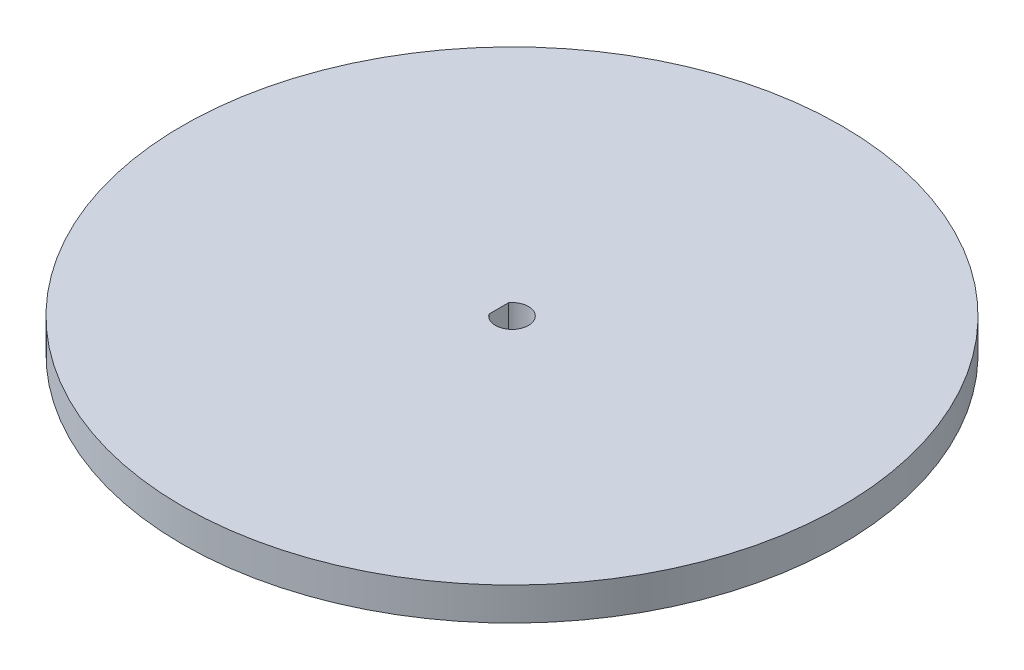
ISO-10303-21;
HEADER;
FILE_DESCRIPTION(('STEP AP214'),'2;1');
FILE_NAME('part.step','',(''),(''),'','','');
FILE_SCHEMA(('AUTOMOTIVE_DESIGN { 1 0 10303 214 1 1 1 1 }'));
ENDSEC;
DATA;
#1=APPLICATION_CONTEXT('core data for automotive mechanical design processes');
#2=APPLICATION_PROTOCOL_DEFINITION('international standard','automotive_design',2000,#1);
#3=PRODUCT_CONTEXT('',#1,'mechanical');
#4=PRODUCT('Part','Part','',(#3));
#5=PRODUCT_RELATED_PRODUCT_CATEGORY('part','',(#4));
#6=PRODUCT_DEFINITION_FORMATION('','',#4);
#7=PRODUCT_DEFINITION_CONTEXT('part definition',#1,'design');
#8=PRODUCT_DEFINITION('design','',#6,#7);
#9=PRODUCT_DEFINITION_SHAPE('','',#8);
#10=(LENGTH_UNIT() NAMED_UNIT(*) SI_UNIT(.MILLI.,.METRE.));
#11=(NAMED_UNIT(*) PLANE_ANGLE_UNIT() SI_UNIT($,.RADIAN.));
#12=(NAMED_UNIT(*) SI_UNIT($,.STERADIAN.) SOLID_ANGLE_UNIT());
#13=UNCERTAINTY_MEASURE_WITH_UNIT(LENGTH_MEASURE(1.E-05),#10,'distance_accuracy_value','');
#14=(GEOMETRIC_REPRESENTATION_CONTEXT(3) GLOBAL_UNCERTAINTY_ASSIGNED_CONTEXT((#13)) GLOBAL_UNIT_ASSIGNED_CONTEXT((#10,
#11,#12)) REPRESENTATION_CONTEXT('',''));
#15=CARTESIAN_POINT('',(0.,0.,0.));
#16=DIRECTION('',(0.,0.,1.));
#17=DIRECTION('',(1.,0.,0.));
#18=AXIS2_PLACEMENT_3D('',#15,#16,#17);
#19=CARTESIAN_POINT('',(0.,10.,0.));
#20=DIRECTION('',(0.,1.,0.));
#21=DIRECTION('',(0.,0.,1.));
#22=AXIS2_PLACEMENT_3D('',#19,#20,#21);
#23=PLANE('',#22);
#24=CARTESIAN_POINT('',(0.,10.,0.));
#25=DIRECTION('',(0.,1.,0.));
#26=DIRECTION('',(0.,0.,1.));
#27=AXIS2_PLACEMENT_3D('',#24,#25,#26);
#28=CIRCLE('',#27,100.);
#29=CARTESIAN_POINT('',(0.,10.,100.));
#30=VERTEX_POINT('',#29);
#31=EDGE_CURVE('E11',#30,#30,#28,.T.);
#32=ORIENTED_EDGE('',*,*,#31,.T.);
#33=EDGE_LOOP('',(#32));
#34=FACE_BOUND('',#33,.T.);
#35=DIRECTION('',(0.,0.,1.));
#36=VECTOR('',#35,1.);
#37=CARTESIAN_POINT('',(-4.,10.,-3.));
#38=LINE('',#37,#36);
#39=CARTESIAN_POINT('',(-4.,10.,-3.));
#40=VERTEX_POINT('',#39);
#41=CARTESIAN_POINT('',(-4.,10.,3.));
#42=VERTEX_POINT('',#41);
#43=EDGE_CURVE('E79',#40,#42,#38,.T.);
#44=ORIENTED_EDGE('',*,*,#43,.F.);
#45=CARTESIAN_POINT('',(0.,10.,0.));
#46=DIRECTION('',(0.,1.,0.));
#47=DIRECTION('',(0.,0.,1.));
#48=AXIS2_PLACEMENT_3D('',#45,#46,#47);
#49=CIRCLE('',#48,5.);
#50=EDGE_CURVE('E70',#42,#40,#49,.T.);
#51=ORIENTED_EDGE('',*,*,#50,.F.);
#52=EDGE_LOOP('',(#44,#51));
#53=FACE_BOUND('',#52,.T.);
#54=ADVANCED_FACE('F38',(#34,#53),#23,.T.);
#55=CARTESIAN_POINT('',(0.,0.,0.));
#56=DIRECTION('',(0.,1.,0.));
#57=DIRECTION('',(0.,0.,1.));
#58=AXIS2_PLACEMENT_3D('',#55,#56,#57);
#59=PLANE('',#58);
#60=CARTESIAN_POINT('',(0.,0.,0.));
#61=DIRECTION('',(0.,1.,0.));
#62=DIRECTION('',(0.,0.,1.));
#63=AXIS2_PLACEMENT_3D('',#60,#61,#62);
#64=CIRCLE('',#63,100.);
#65=CARTESIAN_POINT('',(0.,0.,100.));
#66=VERTEX_POINT('',#65);
#67=EDGE_CURVE('E42',#66,#66,#64,.T.);
#68=ORIENTED_EDGE('',*,*,#67,.F.);
#69=EDGE_LOOP('',(#68));
#70=FACE_BOUND('',#69,.T.);
#71=CARTESIAN_POINT('',(0.,0.,0.));
#72=DIRECTION('',(0.,1.,0.));
#73=DIRECTION('',(0.,0.,1.));
#74=AXIS2_PLACEMENT_3D('',#71,#72,#73);
#75=CIRCLE('',#74,5.);
#76=CARTESIAN_POINT('',(-4.,0.,3.));
#77=VERTEX_POINT('',#76);
#78=CARTESIAN_POINT('',(-4.,0.,-3.));
#79=VERTEX_POINT('',#78);
#80=EDGE_CURVE('E60',#77,#79,#75,.T.);
#81=ORIENTED_EDGE('',*,*,#80,.T.);
#82=DIRECTION('',(0.,0.,1.));
#83=VECTOR('',#82,1.);
#84=CARTESIAN_POINT('',(-4.,0.,-3.));
#85=LINE('',#84,#83);
#86=EDGE_CURVE('E66',#79,#77,#85,.T.);
#87=ORIENTED_EDGE('',*,*,#86,.T.);
#88=EDGE_LOOP('',(#81,#87));
#89=FACE_BOUND('',#88,.T.);
#90=ADVANCED_FACE('F76',(#70,#89),#59,.F.);
#91=CARTESIAN_POINT('',(0.,10.,0.));
#92=DIRECTION('',(0.,-1.,0.));
#93=DIRECTION('',(0.,0.,-1.));
#94=AXIS2_PLACEMENT_3D('',#91,#92,#93);
#95=CYLINDRICAL_SURFACE('',#94,100.);
#96=ORIENTED_EDGE('',*,*,#31,.F.);
#97=EDGE_LOOP('',(#96));
#98=FACE_BOUND('',#97,.T.);
#99=ORIENTED_EDGE('',*,*,#67,.T.);
#100=EDGE_LOOP('',(#99));
#101=FACE_BOUND('',#100,.T.);
#102=ADVANCED_FACE('F40',(#98,#101),#95,.T.);
#103=CARTESIAN_POINT('',(0.,10.,0.));
#104=DIRECTION('',(0.,-1.,0.));
#105=DIRECTION('',(0.,0.,-1.));
#106=AXIS2_PLACEMENT_3D('',#103,#104,#105);
#107=CYLINDRICAL_SURFACE('',#106,5.);
#108=ORIENTED_EDGE('',*,*,#80,.F.);
#109=DIRECTION('',(0.,-1.,0.));
#110=VECTOR('',#109,1.);
#111=CARTESIAN_POINT('',(-4.,10.,3.));
#112=LINE('',#111,#110);
#113=EDGE_CURVE('E68',#42,#77,#112,.T.);
#114=ORIENTED_EDGE('',*,*,#113,.F.);
#115=ORIENTED_EDGE('',*,*,#50,.T.);
#116=DIRECTION('',(0.,-1.,0.));
#117=VECTOR('',#116,1.);
#118=CARTESIAN_POINT('',(-4.,10.,-3.));
#119=LINE('',#118,#117);
#120=EDGE_CURVE('E53',#40,#79,#119,.T.);
#121=ORIENTED_EDGE('',*,*,#120,.T.);
#122=EDGE_LOOP('',(#108,#114,#115,#121));
#123=FACE_BOUND('',#122,.T.);
#124=ADVANCED_FACE('F72',(#123),#107,.F.);
#125=CARTESIAN_POINT('',(-4.,10.,-3.));
#126=DIRECTION('',(1.,0.,0.));
#127=DIRECTION('',(0.,0.,-1.));
#128=AXIS2_PLACEMENT_3D('',#125,#126,#127);
#129=PLANE('',#128);
#130=ORIENTED_EDGE('',*,*,#86,.F.);
#131=ORIENTED_EDGE('',*,*,#120,.F.);
#132=ORIENTED_EDGE('',*,*,#43,.T.);
#133=ORIENTED_EDGE('',*,*,#113,.T.);
#134=EDGE_LOOP('',(#130,#131,#132,#133));
#135=FACE_BOUND('',#134,.T.);
#136=ADVANCED_FACE('F67',(#135),#129,.T.);
#137=CLOSED_SHELL('',(#54,#90,#102,#124,#136));
#138=MANIFOLD_SOLID_BREP('B2',#137);
#139=ADVANCED_BREP_SHAPE_REPRESENTATION('',(#18,#138),#14);
#140=SHAPE_DEFINITION_REPRESENTATION(#9,#139);
ENDSEC;
END-ISO-10303-21;
